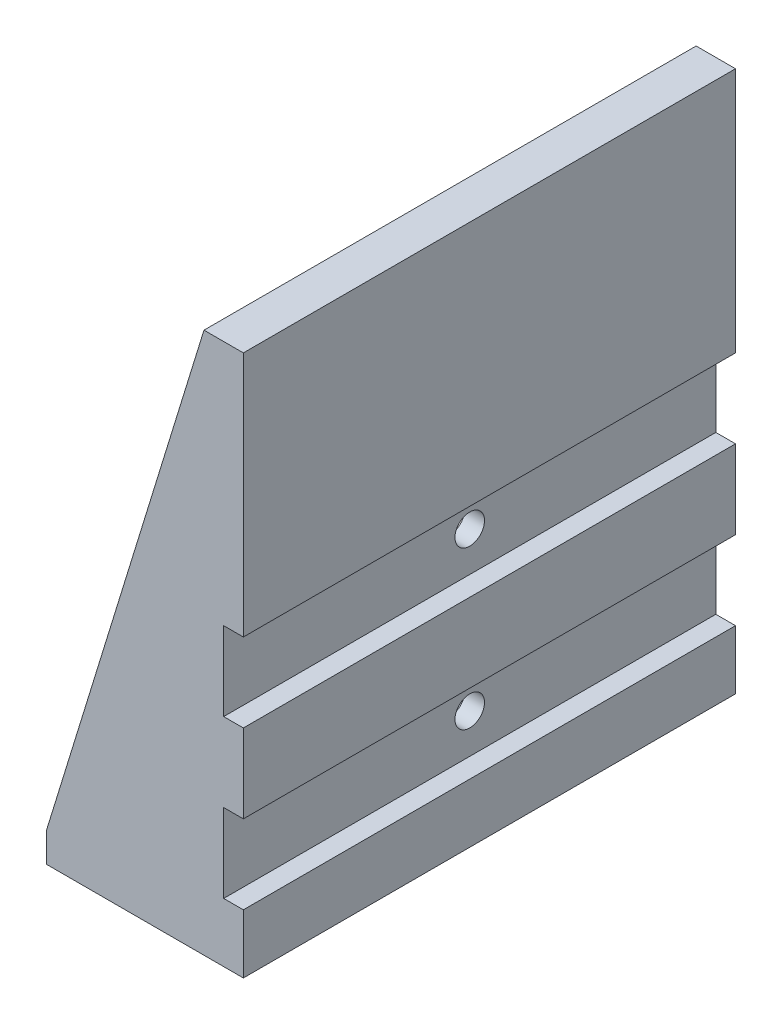
ISO-10303-21;
HEADER;
FILE_DESCRIPTION(('STEP AP214'),'2;1');
FILE_NAME('part.step','',(''),(''),'','','');
FILE_SCHEMA(('AUTOMOTIVE_DESIGN { 1 0 10303 214 1 1 1 1 }'));
ENDSEC;
DATA;
#1=APPLICATION_CONTEXT('core data for automotive mechanical design processes');
#2=APPLICATION_PROTOCOL_DEFINITION('international standard','automotive_design',2000,#1);
#3=PRODUCT_CONTEXT('',#1,'mechanical');
#4=PRODUCT('Part','Part','',(#3));
#5=PRODUCT_RELATED_PRODUCT_CATEGORY('part','',(#4));
#6=PRODUCT_DEFINITION_FORMATION('','',#4);
#7=PRODUCT_DEFINITION_CONTEXT('part definition',#1,'design');
#8=PRODUCT_DEFINITION('design','',#6,#7);
#9=PRODUCT_DEFINITION_SHAPE('','',#8);
#10=(LENGTH_UNIT() NAMED_UNIT(*) SI_UNIT(.MILLI.,.METRE.));
#11=(NAMED_UNIT(*) PLANE_ANGLE_UNIT() SI_UNIT($,.RADIAN.));
#12=(NAMED_UNIT(*) SI_UNIT($,.STERADIAN.) SOLID_ANGLE_UNIT());
#13=UNCERTAINTY_MEASURE_WITH_UNIT(LENGTH_MEASURE(1.E-05),#10,'distance_accuracy_value','');
#14=(GEOMETRIC_REPRESENTATION_CONTEXT(3) GLOBAL_UNCERTAINTY_ASSIGNED_CONTEXT((#13)) GLOBAL_UNIT_ASSIGNED_CONTEXT((#10,
#11,#12)) REPRESENTATION_CONTEXT('',''));
#15=CARTESIAN_POINT('',(0.,0.,0.));
#16=DIRECTION('',(0.,0.,1.));
#17=DIRECTION('',(1.,0.,0.));
#18=AXIS2_PLACEMENT_3D('',#15,#16,#17);
#19=CARTESIAN_POINT('',(-10.,3.,50.));
#20=DIRECTION('',(0.95577900872195,-0.294085848837523,0.));
#21=DIRECTION('',(0.294085848837523,0.95577900872195,0.));
#22=AXIS2_PLACEMENT_3D('',#19,#20,#21);
#23=PLANE('',#22);
#24=DIRECTION('',(0.,0.,-1.));
#25=VECTOR('',#24,1.);
#26=CARTESIAN_POINT('',(6.,55.,50.));
#27=LINE('',#26,#25);
#28=CARTESIAN_POINT('',(6.,55.,50.));
#29=VERTEX_POINT('',#28);
#30=CARTESIAN_POINT('',(6.,55.,47.5));
#31=VERTEX_POINT('',#30);
#32=EDGE_CURVE('E325',#29,#31,#27,.T.);
#33=ORIENTED_EDGE('',*,*,#32,.T.);
#34=DIRECTION('',(-0.294085848837523,-0.95577900872195,0.));
#35=VECTOR('',#34,1.);
#36=CARTESIAN_POINT('',(-10.,3.,47.5));
#37=LINE('',#36,#35);
#38=CARTESIAN_POINT('',(-10.,3.,47.5));
#39=VERTEX_POINT('',#38);
#40=EDGE_CURVE('E11',#31,#39,#37,.T.);
#41=ORIENTED_EDGE('',*,*,#40,.T.);
#42=DIRECTION('',(0.,0.,-1.));
#43=VECTOR('',#42,1.);
#44=CARTESIAN_POINT('',(-10.,3.,50.));
#45=LINE('',#44,#43);
#46=CARTESIAN_POINT('',(-10.,3.,50.));
#47=VERTEX_POINT('',#46);
#48=EDGE_CURVE('E321',#47,#39,#45,.T.);
#49=ORIENTED_EDGE('',*,*,#48,.F.);
#50=DIRECTION('',(-0.294085848837523,-0.95577900872195,0.));
#51=VECTOR('',#50,1.);
#52=CARTESIAN_POINT('',(-10.,3.,50.));
#53=LINE('',#52,#51);
#54=EDGE_CURVE('E294',#29,#47,#53,.T.);
#55=ORIENTED_EDGE('',*,*,#54,.F.);
#56=EDGE_LOOP('',(#33,#41,#49,#55));
#57=FACE_BOUND('',#56,.T.);
#58=ADVANCED_FACE('F33',(#57),#23,.F.);
#59=CARTESIAN_POINT('',(10.,0.,50.));
#60=DIRECTION('',(-1.,0.,0.));
#61=DIRECTION('',(0.,0.,1.));
#62=AXIS2_PLACEMENT_3D('',#59,#60,#61);
#63=PLANE('',#62);
#64=DIRECTION('',(0.,1.,0.));
#65=VECTOR('',#64,1.);
#66=CARTESIAN_POINT('',(10.,0.,50.));
#67=LINE('',#66,#65);
#68=CARTESIAN_POINT('',(10.,30.,50.));
#69=VERTEX_POINT('',#68);
#70=CARTESIAN_POINT('',(10.,55.,50.));
#71=VERTEX_POINT('',#70);
#72=EDGE_CURVE('E292',#69,#71,#67,.T.);
#73=ORIENTED_EDGE('',*,*,#72,.F.);
#74=DIRECTION('',(0.,0.,1.));
#75=VECTOR('',#74,1.);
#76=CARTESIAN_POINT('',(10.,30.,50.));
#77=LINE('',#76,#75);
#78=CARTESIAN_POINT('',(10.,30.,0.));
#79=VERTEX_POINT('',#78);
#80=EDGE_CURVE('E243',#79,#69,#77,.T.);
#81=ORIENTED_EDGE('',*,*,#80,.F.);
#82=DIRECTION('',(0.,1.,0.));
#83=VECTOR('',#82,1.);
#84=CARTESIAN_POINT('',(10.,0.,0.));
#85=LINE('',#84,#83);
#86=CARTESIAN_POINT('',(10.,55.,0.));
#87=VERTEX_POINT('',#86);
#88=EDGE_CURVE('E280',#79,#87,#85,.T.);
#89=ORIENTED_EDGE('',*,*,#88,.T.);
#90=DIRECTION('',(0.,0.,-1.));
#91=VECTOR('',#90,1.);
#92=CARTESIAN_POINT('',(10.,55.,50.));
#93=LINE('',#92,#91);
#94=EDGE_CURVE('E328',#71,#87,#93,.T.);
#95=ORIENTED_EDGE('',*,*,#94,.F.);
#96=EDGE_LOOP('',(#73,#81,#89,#95));
#97=FACE_BOUND('',#96,.T.);
#98=ADVANCED_FACE('F387',(#97),#63,.F.);
#99=CARTESIAN_POINT('',(10.,14.,0.));
#100=VERTEX_POINT('',#99);
#101=CARTESIAN_POINT('',(10.,22.,0.));
#102=VERTEX_POINT('',#101);
#103=EDGE_CURVE('E305',#100,#102,#85,.T.);
#104=ORIENTED_EDGE('',*,*,#103,.T.);
#105=DIRECTION('',(0.,0.,-1.));
#106=VECTOR('',#105,1.);
#107=CARTESIAN_POINT('',(10.,22.,50.));
#108=LINE('',#107,#106);
#109=CARTESIAN_POINT('',(10.,22.,50.));
#110=VERTEX_POINT('',#109);
#111=EDGE_CURVE('E237',#110,#102,#108,.T.);
#112=ORIENTED_EDGE('',*,*,#111,.F.);
#113=CARTESIAN_POINT('',(10.,14.,50.));
#114=VERTEX_POINT('',#113);
#115=EDGE_CURVE('E291',#114,#110,#67,.T.);
#116=ORIENTED_EDGE('',*,*,#115,.F.);
#117=DIRECTION('',(0.,0.,1.));
#118=VECTOR('',#117,1.);
#119=CARTESIAN_POINT('',(10.,14.,50.));
#120=LINE('',#119,#118);
#121=EDGE_CURVE('E267',#100,#114,#120,.T.);
#122=ORIENTED_EDGE('',*,*,#121,.F.);
#123=EDGE_LOOP('',(#104,#112,#116,#122));
#124=FACE_BOUND('',#123,.T.);
#125=ADVANCED_FACE('F392',(#124),#63,.F.);
#126=CARTESIAN_POINT('',(10.,0.,0.));
#127=VERTEX_POINT('',#126);
#128=CARTESIAN_POINT('',(10.,6.00000000000001,0.));
#129=VERTEX_POINT('',#128);
#130=EDGE_CURVE('E301',#127,#129,#85,.T.);
#131=ORIENTED_EDGE('',*,*,#130,.T.);
#132=DIRECTION('',(0.,0.,-1.));
#133=VECTOR('',#132,1.);
#134=CARTESIAN_POINT('',(10.,6.,50.));
#135=LINE('',#134,#133);
#136=CARTESIAN_POINT('',(10.,6.,50.));
#137=VERTEX_POINT('',#136);
#138=EDGE_CURVE('E256',#137,#129,#135,.T.);
#139=ORIENTED_EDGE('',*,*,#138,.F.);
#140=CARTESIAN_POINT('',(10.,0.,50.));
#141=VERTEX_POINT('',#140);
#142=EDGE_CURVE('E287',#141,#137,#67,.T.);
#143=ORIENTED_EDGE('',*,*,#142,.F.);
#144=DIRECTION('',(0.,0.,-1.));
#145=VECTOR('',#144,1.);
#146=CARTESIAN_POINT('',(10.,0.,50.));
#147=LINE('',#146,#145);
#148=EDGE_CURVE('E300',#141,#127,#147,.T.);
#149=ORIENTED_EDGE('',*,*,#148,.T.);
#150=EDGE_LOOP('',(#131,#139,#143,#149));
#151=FACE_BOUND('',#150,.T.);
#152=ADVANCED_FACE('F35',(#151),#63,.F.);
#153=CARTESIAN_POINT('',(6.,55.,50.));
#154=DIRECTION('',(0.,-1.,0.));
#155=DIRECTION('',(0.,0.,-1.));
#156=AXIS2_PLACEMENT_3D('',#153,#154,#155);
#157=PLANE('',#156);
#158=DIRECTION('',(-1.,0.,0.));
#159=VECTOR('',#158,1.);
#160=CARTESIAN_POINT('',(6.,55.,0.));
#161=LINE('',#160,#159);
#162=CARTESIAN_POINT('',(6.,55.,0.));
#163=VERTEX_POINT('',#162);
#164=EDGE_CURVE('E304',#87,#163,#161,.T.);
#165=ORIENTED_EDGE('',*,*,#164,.T.);
#166=CARTESIAN_POINT('',(6.,55.,2.5));
#167=VERTEX_POINT('',#166);
#168=EDGE_CURVE('E324',#167,#163,#27,.T.);
#169=ORIENTED_EDGE('',*,*,#168,.F.);
#170=DIRECTION('',(0.,0.,-1.));
#171=VECTOR('',#170,1.);
#172=CARTESIAN_POINT('',(6.,55.,2.5));
#173=LINE('',#172,#171);
#174=EDGE_CURVE('E220',#31,#167,#173,.T.);
#175=ORIENTED_EDGE('',*,*,#174,.F.);
#176=ORIENTED_EDGE('',*,*,#32,.F.);
#177=DIRECTION('',(-1.,0.,0.));
#178=VECTOR('',#177,1.);
#179=CARTESIAN_POINT('',(6.,55.,50.));
#180=LINE('',#179,#178);
#181=EDGE_CURVE('E290',#71,#29,#180,.T.);
#182=ORIENTED_EDGE('',*,*,#181,.F.);
#183=ORIENTED_EDGE('',*,*,#94,.T.);
#184=EDGE_LOOP('',(#165,#169,#175,#176,#182,#183));
#185=FACE_BOUND('',#184,.T.);
#186=ADVANCED_FACE('F340',(#185),#157,.F.);
#187=CARTESIAN_POINT('',(-10.,3.,2.5));
#188=VERTEX_POINT('',#187);
#189=CARTESIAN_POINT('',(-10.,3.,0.));
#190=VERTEX_POINT('',#189);
#191=EDGE_CURVE('E320',#188,#190,#45,.T.);
#192=ORIENTED_EDGE('',*,*,#191,.F.);
#193=DIRECTION('',(0.294085848837523,0.95577900872195,0.));
#194=VECTOR('',#193,1.);
#195=CARTESIAN_POINT('',(-10.,3.,2.5));
#196=LINE('',#195,#194);
#197=EDGE_CURVE('E41',#188,#167,#196,.T.);
#198=ORIENTED_EDGE('',*,*,#197,.T.);
#199=ORIENTED_EDGE('',*,*,#168,.T.);
#200=DIRECTION('',(-0.294085848837523,-0.95577900872195,0.));
#201=VECTOR('',#200,1.);
#202=CARTESIAN_POINT('',(-10.,3.,0.));
#203=LINE('',#202,#201);
#204=EDGE_CURVE('E308',#163,#190,#203,.T.);
#205=ORIENTED_EDGE('',*,*,#204,.T.);
#206=EDGE_LOOP('',(#192,#198,#199,#205));
#207=FACE_BOUND('',#206,.T.);
#208=ADVANCED_FACE('F335',(#207),#23,.F.);
#209=CARTESIAN_POINT('',(-10.,0.,50.));
#210=DIRECTION('',(1.,0.,0.));
#211=DIRECTION('',(0.,0.,-1.));
#212=AXIS2_PLACEMENT_3D('',#209,#210,#211);
#213=PLANE('',#212);
#214=DIRECTION('',(0.,-1.,0.));
#215=VECTOR('',#214,1.);
#216=CARTESIAN_POINT('',(-10.,0.,0.));
#217=LINE('',#216,#215);
#218=CARTESIAN_POINT('',(-10.,0.,0.));
#219=VERTEX_POINT('',#218);
#220=EDGE_CURVE('E311',#190,#219,#217,.T.);
#221=ORIENTED_EDGE('',*,*,#220,.T.);
#222=DIRECTION('',(0.,0.,-1.));
#223=VECTOR('',#222,1.);
#224=CARTESIAN_POINT('',(-10.,0.,50.));
#225=LINE('',#224,#223);
#226=CARTESIAN_POINT('',(-10.,0.,50.));
#227=VERTEX_POINT('',#226);
#228=EDGE_CURVE('E317',#227,#219,#225,.T.);
#229=ORIENTED_EDGE('',*,*,#228,.F.);
#230=DIRECTION('',(0.,-1.,0.));
#231=VECTOR('',#230,1.);
#232=CARTESIAN_POINT('',(-10.,0.,50.));
#233=LINE('',#232,#231);
#234=EDGE_CURVE('E296',#47,#227,#233,.T.);
#235=ORIENTED_EDGE('',*,*,#234,.F.);
#236=ORIENTED_EDGE('',*,*,#48,.T.);
#237=DIRECTION('',(0.,0.,1.));
#238=VECTOR('',#237,1.);
#239=CARTESIAN_POINT('',(-10.,3.,47.5));
#240=LINE('',#239,#238);
#241=EDGE_CURVE('E219',#188,#39,#240,.T.);
#242=ORIENTED_EDGE('',*,*,#241,.F.);
#243=ORIENTED_EDGE('',*,*,#191,.T.);
#244=EDGE_LOOP('',(#221,#229,#235,#236,#242,#243));
#245=FACE_BOUND('',#244,.T.);
#246=ADVANCED_FACE('F355',(#245),#213,.F.);
#247=CARTESIAN_POINT('',(-10.,0.,50.));
#248=DIRECTION('',(0.,1.,0.));
#249=DIRECTION('',(-1.,0.,0.));
#250=AXIS2_PLACEMENT_3D('',#247,#248,#249);
#251=PLANE('',#250);
#252=DIRECTION('',(-1.,0.,0.));
#253=VECTOR('',#252,1.);
#254=CARTESIAN_POINT('',(-10.,0.,24.));
#255=LINE('',#254,#253);
#256=CARTESIAN_POINT('',(3.,0.,24.));
#257=VERTEX_POINT('',#256);
#258=CARTESIAN_POINT('',(-7.,0.,24.));
#259=VERTEX_POINT('',#258);
#260=EDGE_CURVE('E201',#257,#259,#255,.T.);
#261=ORIENTED_EDGE('',*,*,#260,.T.);
#262=CARTESIAN_POINT('',(-7.,0.,25.));
#263=DIRECTION('',(0.,1.,0.));
#264=DIRECTION('',(-1.,0.,0.));
#265=AXIS2_PLACEMENT_3D('',#262,#263,#264);
#266=CIRCLE('',#265,1.);
#267=CARTESIAN_POINT('',(-7.,0.,26.));
#268=VERTEX_POINT('',#267);
#269=EDGE_CURVE('E204',#259,#268,#266,.T.);
#270=ORIENTED_EDGE('',*,*,#269,.T.);
#271=DIRECTION('',(1.,0.,0.));
#272=VECTOR('',#271,1.);
#273=CARTESIAN_POINT('',(-10.,0.,26.));
#274=LINE('',#273,#272);
#275=CARTESIAN_POINT('',(3.,0.,26.));
#276=VERTEX_POINT('',#275);
#277=EDGE_CURVE('E196',#268,#276,#274,.T.);
#278=ORIENTED_EDGE('',*,*,#277,.T.);
#279=CARTESIAN_POINT('',(3.,0.,25.));
#280=DIRECTION('',(0.,1.,0.));
#281=DIRECTION('',(-1.,0.,0.));
#282=AXIS2_PLACEMENT_3D('',#279,#280,#281);
#283=CIRCLE('',#282,1.);
#284=EDGE_CURVE('E176',#276,#257,#283,.T.);
#285=ORIENTED_EDGE('',*,*,#284,.T.);
#286=EDGE_LOOP('',(#261,#270,#278,#285));
#287=FACE_BOUND('',#286,.T.);
#288=DIRECTION('',(1.,0.,0.));
#289=VECTOR('',#288,1.);
#290=CARTESIAN_POINT('',(-10.,0.,0.));
#291=LINE('',#290,#289);
#292=EDGE_CURVE('E313',#219,#127,#291,.T.);
#293=ORIENTED_EDGE('',*,*,#292,.T.);
#294=ORIENTED_EDGE('',*,*,#148,.F.);
#295=DIRECTION('',(1.,0.,0.));
#296=VECTOR('',#295,1.);
#297=CARTESIAN_POINT('',(-10.,0.,50.));
#298=LINE('',#297,#296);
#299=EDGE_CURVE('E298',#227,#141,#298,.T.);
#300=ORIENTED_EDGE('',*,*,#299,.F.);
#301=ORIENTED_EDGE('',*,*,#228,.T.);
#302=EDGE_LOOP('',(#293,#294,#300,#301));
#303=FACE_BOUND('',#302,.T.);
#304=ADVANCED_FACE('F359',(#287,#303),#251,.F.);
#305=CARTESIAN_POINT('',(0.,0.,50.));
#306=DIRECTION('',(0.,0.,-1.));
#307=DIRECTION('',(-1.,0.,0.));
#308=AXIS2_PLACEMENT_3D('',#305,#306,#307);
#309=PLANE('',#308);
#310=DIRECTION('',(0.,-1.,0.));
#311=VECTOR('',#310,1.);
#312=CARTESIAN_POINT('',(8.,22.,50.));
#313=LINE('',#312,#311);
#314=CARTESIAN_POINT('',(8.,30.,50.));
#315=VERTEX_POINT('',#314);
#316=CARTESIAN_POINT('',(8.,22.,50.));
#317=VERTEX_POINT('',#316);
#318=EDGE_CURVE('E239',#315,#317,#313,.T.);
#319=ORIENTED_EDGE('',*,*,#318,.F.);
#320=DIRECTION('',(1.,0.,0.));
#321=VECTOR('',#320,1.);
#322=CARTESIAN_POINT('',(8.,30.,50.));
#323=LINE('',#322,#321);
#324=EDGE_CURVE('E253',#315,#69,#323,.T.);
#325=ORIENTED_EDGE('',*,*,#324,.T.);
#326=ORIENTED_EDGE('',*,*,#72,.T.);
#327=ORIENTED_EDGE('',*,*,#181,.T.);
#328=ORIENTED_EDGE('',*,*,#54,.T.);
#329=ORIENTED_EDGE('',*,*,#234,.T.);
#330=ORIENTED_EDGE('',*,*,#299,.T.);
#331=ORIENTED_EDGE('',*,*,#142,.T.);
#332=DIRECTION('',(1.,0.,0.));
#333=VECTOR('',#332,1.);
#334=CARTESIAN_POINT('',(8.,6.,50.));
#335=LINE('',#334,#333);
#336=CARTESIAN_POINT('',(8.,6.,50.));
#337=VERTEX_POINT('',#336);
#338=EDGE_CURVE('E274',#337,#137,#335,.T.);
#339=ORIENTED_EDGE('',*,*,#338,.F.);
#340=DIRECTION('',(0.,-1.,0.));
#341=VECTOR('',#340,1.);
#342=CARTESIAN_POINT('',(8.,14.,50.));
#343=LINE('',#342,#341);
#344=CARTESIAN_POINT('',(8.,14.,50.));
#345=VERTEX_POINT('',#344);
#346=EDGE_CURVE('E263',#345,#337,#343,.T.);
#347=ORIENTED_EDGE('',*,*,#346,.F.);
#348=DIRECTION('',(1.,0.,0.));
#349=VECTOR('',#348,1.);
#350=CARTESIAN_POINT('',(8.,14.,50.));
#351=LINE('',#350,#349);
#352=EDGE_CURVE('E277',#345,#114,#351,.T.);
#353=ORIENTED_EDGE('',*,*,#352,.T.);
#354=ORIENTED_EDGE('',*,*,#115,.T.);
#355=DIRECTION('',(1.,0.,0.));
#356=VECTOR('',#355,1.);
#357=CARTESIAN_POINT('',(8.,22.,50.));
#358=LINE('',#357,#356);
#359=EDGE_CURVE('E250',#317,#110,#358,.T.);
#360=ORIENTED_EDGE('',*,*,#359,.F.);
#361=EDGE_LOOP('',(#319,#325,#326,#327,#328,#329,#330,#331,#339,#347,#353,#354,#360));
#362=FACE_BOUND('',#361,.T.);
#363=ADVANCED_FACE('F364',(#362),#309,.F.);
#364=CARTESIAN_POINT('',(0.,0.,0.));
#365=DIRECTION('',(0.,0.,-1.));
#366=DIRECTION('',(-1.,0.,0.));
#367=AXIS2_PLACEMENT_3D('',#364,#365,#366);
#368=PLANE('',#367);
#369=DIRECTION('',(1.,0.,0.));
#370=VECTOR('',#369,1.);
#371=CARTESIAN_POINT('',(8.,30.,0.));
#372=LINE('',#371,#370);
#373=CARTESIAN_POINT('',(8.,30.,0.));
#374=VERTEX_POINT('',#373);
#375=EDGE_CURVE('E257',#374,#79,#372,.T.);
#376=ORIENTED_EDGE('',*,*,#375,.F.);
#377=DIRECTION('',(0.,1.,0.));
#378=VECTOR('',#377,1.);
#379=CARTESIAN_POINT('',(8.,22.,0.));
#380=LINE('',#379,#378);
#381=CARTESIAN_POINT('',(8.,22.,0.));
#382=VERTEX_POINT('',#381);
#383=EDGE_CURVE('E245',#382,#374,#380,.T.);
#384=ORIENTED_EDGE('',*,*,#383,.F.);
#385=DIRECTION('',(1.,0.,0.));
#386=VECTOR('',#385,1.);
#387=CARTESIAN_POINT('',(8.,22.,0.));
#388=LINE('',#387,#386);
#389=EDGE_CURVE('E259',#382,#102,#388,.T.);
#390=ORIENTED_EDGE('',*,*,#389,.T.);
#391=ORIENTED_EDGE('',*,*,#103,.F.);
#392=DIRECTION('',(1.,0.,0.));
#393=VECTOR('',#392,1.);
#394=CARTESIAN_POINT('',(8.,14.,0.));
#395=LINE('',#394,#393);
#396=CARTESIAN_POINT('',(8.,14.,0.));
#397=VERTEX_POINT('',#396);
#398=EDGE_CURVE('E281',#397,#100,#395,.T.);
#399=ORIENTED_EDGE('',*,*,#398,.F.);
#400=DIRECTION('',(0.,1.,0.));
#401=VECTOR('',#400,1.);
#402=CARTESIAN_POINT('',(8.,14.,0.));
#403=LINE('',#402,#401);
#404=CARTESIAN_POINT('',(8.,6.,0.));
#405=VERTEX_POINT('',#404);
#406=EDGE_CURVE('E269',#405,#397,#403,.T.);
#407=ORIENTED_EDGE('',*,*,#406,.F.);
#408=DIRECTION('',(1.,0.,0.));
#409=VECTOR('',#408,1.);
#410=CARTESIAN_POINT('',(8.,6.00000000000001,0.));
#411=LINE('',#410,#409);
#412=EDGE_CURVE('E283',#405,#129,#411,.T.);
#413=ORIENTED_EDGE('',*,*,#412,.T.);
#414=ORIENTED_EDGE('',*,*,#130,.F.);
#415=ORIENTED_EDGE('',*,*,#292,.F.);
#416=ORIENTED_EDGE('',*,*,#220,.F.);
#417=ORIENTED_EDGE('',*,*,#204,.F.);
#418=ORIENTED_EDGE('',*,*,#164,.F.);
#419=ORIENTED_EDGE('',*,*,#88,.F.);
#420=EDGE_LOOP('',(#376,#384,#390,#391,#399,#407,#413,#414,#415,#416,#417,#418,#419));
#421=FACE_BOUND('',#420,.T.);
#422=ADVANCED_FACE('F350',(#421),#368,.T.);
#423=CARTESIAN_POINT('',(8.,14.,50.));
#424=DIRECTION('',(0.,1.,0.));
#425=DIRECTION('',(0.,0.,1.));
#426=AXIS2_PLACEMENT_3D('',#423,#424,#425);
#427=PLANE('',#426);
#428=ORIENTED_EDGE('',*,*,#121,.T.);
#429=ORIENTED_EDGE('',*,*,#352,.F.);
#430=DIRECTION('',(0.,0.,1.));
#431=VECTOR('',#430,1.);
#432=CARTESIAN_POINT('',(8.,14.,50.));
#433=LINE('',#432,#431);
#434=EDGE_CURVE('E271',#397,#345,#433,.T.);
#435=ORIENTED_EDGE('',*,*,#434,.F.);
#436=ORIENTED_EDGE('',*,*,#398,.T.);
#437=EDGE_LOOP('',(#428,#429,#435,#436));
#438=FACE_BOUND('',#437,.T.);
#439=ADVANCED_FACE('F421',(#438),#427,.F.);
#440=CARTESIAN_POINT('',(8.,6.,50.));
#441=DIRECTION('',(0.,-1.,0.));
#442=DIRECTION('',(0.,0.,-1.));
#443=AXIS2_PLACEMENT_3D('',#440,#441,#442);
#444=PLANE('',#443);
#445=ORIENTED_EDGE('',*,*,#138,.T.);
#446=ORIENTED_EDGE('',*,*,#412,.F.);
#447=DIRECTION('',(0.,0.,-1.));
#448=VECTOR('',#447,1.);
#449=CARTESIAN_POINT('',(8.,6.,50.));
#450=LINE('',#449,#448);
#451=EDGE_CURVE('E266',#337,#405,#450,.T.);
#452=ORIENTED_EDGE('',*,*,#451,.F.);
#453=ORIENTED_EDGE('',*,*,#338,.T.);
#454=EDGE_LOOP('',(#445,#446,#452,#453));
#455=FACE_BOUND('',#454,.T.);
#456=ADVANCED_FACE('F413',(#455),#444,.F.);
#457=CARTESIAN_POINT('',(8.,0.,0.));
#458=DIRECTION('',(1.,0.,0.));
#459=DIRECTION('',(0.,0.,-1.));
#460=AXIS2_PLACEMENT_3D('',#457,#458,#459);
#461=PLANE('',#460);
#462=CARTESIAN_POINT('',(8.,10.,25.));
#463=DIRECTION('',(1.,0.,0.));
#464=DIRECTION('',(0.,0.,-1.));
#465=AXIS2_PLACEMENT_3D('',#462,#463,#464);
#466=CIRCLE('',#465,1.5);
#467=CARTESIAN_POINT('',(8.,10.,23.5));
#468=VERTEX_POINT('',#467);
#469=EDGE_CURVE('E207',#468,#468,#466,.T.);
#470=ORIENTED_EDGE('',*,*,#469,.F.);
#471=EDGE_LOOP('',(#470));
#472=FACE_BOUND('',#471,.T.);
#473=ORIENTED_EDGE('',*,*,#346,.T.);
#474=ORIENTED_EDGE('',*,*,#451,.T.);
#475=ORIENTED_EDGE('',*,*,#406,.T.);
#476=ORIENTED_EDGE('',*,*,#434,.T.);
#477=EDGE_LOOP('',(#473,#474,#475,#476));
#478=FACE_BOUND('',#477,.T.);
#479=ADVANCED_FACE('F418',(#472,#478),#461,.T.);
#480=CARTESIAN_POINT('',(8.,30.,50.));
#481=DIRECTION('',(0.,1.,0.));
#482=DIRECTION('',(0.,0.,1.));
#483=AXIS2_PLACEMENT_3D('',#480,#481,#482);
#484=PLANE('',#483);
#485=ORIENTED_EDGE('',*,*,#80,.T.);
#486=ORIENTED_EDGE('',*,*,#324,.F.);
#487=DIRECTION('',(0.,0.,1.));
#488=VECTOR('',#487,1.);
#489=CARTESIAN_POINT('',(8.,30.,50.));
#490=LINE('',#489,#488);
#491=EDGE_CURVE('E247',#374,#315,#490,.T.);
#492=ORIENTED_EDGE('',*,*,#491,.F.);
#493=ORIENTED_EDGE('',*,*,#375,.T.);
#494=EDGE_LOOP('',(#485,#486,#492,#493));
#495=FACE_BOUND('',#494,.T.);
#496=ADVANCED_FACE('F432',(#495),#484,.F.);
#497=CARTESIAN_POINT('',(8.,22.,50.));
#498=DIRECTION('',(0.,-1.,0.));
#499=DIRECTION('',(0.,0.,-1.));
#500=AXIS2_PLACEMENT_3D('',#497,#498,#499);
#501=PLANE('',#500);
#502=ORIENTED_EDGE('',*,*,#111,.T.);
#503=ORIENTED_EDGE('',*,*,#389,.F.);
#504=DIRECTION('',(0.,0.,-1.));
#505=VECTOR('',#504,1.);
#506=CARTESIAN_POINT('',(8.,22.,50.));
#507=LINE('',#506,#505);
#508=EDGE_CURVE('E242',#317,#382,#507,.T.);
#509=ORIENTED_EDGE('',*,*,#508,.F.);
#510=ORIENTED_EDGE('',*,*,#359,.T.);
#511=EDGE_LOOP('',(#502,#503,#509,#510));
#512=FACE_BOUND('',#511,.T.);
#513=ADVANCED_FACE('F436',(#512),#501,.F.);
#514=CARTESIAN_POINT('',(8.,0.,0.));
#515=DIRECTION('',(-1.,0.,0.));
#516=DIRECTION('',(0.,0.,1.));
#517=AXIS2_PLACEMENT_3D('',#514,#515,#516);
#518=PLANE('',#517);
#519=CARTESIAN_POINT('',(8.,26.,25.));
#520=DIRECTION('',(1.,0.,0.));
#521=DIRECTION('',(0.,0.,-1.));
#522=AXIS2_PLACEMENT_3D('',#519,#520,#521);
#523=CIRCLE('',#522,1.5);
#524=CARTESIAN_POINT('',(8.,26.,23.5));
#525=VERTEX_POINT('',#524);
#526=EDGE_CURVE('E213',#525,#525,#523,.T.);
#527=ORIENTED_EDGE('',*,*,#526,.F.);
#528=EDGE_LOOP('',(#527));
#529=FACE_BOUND('',#528,.T.);
#530=ORIENTED_EDGE('',*,*,#318,.T.);
#531=ORIENTED_EDGE('',*,*,#508,.T.);
#532=ORIENTED_EDGE('',*,*,#383,.T.);
#533=ORIENTED_EDGE('',*,*,#491,.T.);
#534=EDGE_LOOP('',(#530,#531,#532,#533));
#535=FACE_BOUND('',#534,.T.);
#536=ADVANCED_FACE('F383',(#529,#535),#518,.F.);
#537=CARTESIAN_POINT('',(6.,55.,47.5));
#538=DIRECTION('',(0.,0.,1.));
#539=DIRECTION('',(0.,-1.,0.));
#540=AXIS2_PLACEMENT_3D('',#537,#538,#539);
#541=PLANE('',#540);
#542=DIRECTION('',(0.,1.,0.));
#543=VECTOR('',#542,1.);
#544=CARTESIAN_POINT('',(6.,55.,47.5));
#545=LINE('',#544,#543);
#546=CARTESIAN_POINT('',(6.,3.,47.5));
#547=VERTEX_POINT('',#546);
#548=EDGE_CURVE('E229',#547,#31,#545,.T.);
#549=ORIENTED_EDGE('',*,*,#548,.F.);
#550=DIRECTION('',(-1.,0.,0.));
#551=VECTOR('',#550,1.);
#552=CARTESIAN_POINT('',(6.,3.,47.5));
#553=LINE('',#552,#551);
#554=EDGE_CURVE('E235',#547,#39,#553,.T.);
#555=ORIENTED_EDGE('',*,*,#554,.T.);
#556=ORIENTED_EDGE('',*,*,#40,.F.);
#557=EDGE_LOOP('',(#549,#555,#556));
#558=FACE_BOUND('',#557,.T.);
#559=ADVANCED_FACE('F371',(#558),#541,.F.);
#560=CARTESIAN_POINT('',(6.,55.,2.5));
#561=DIRECTION('',(0.,0.,-1.));
#562=DIRECTION('',(0.,1.,0.));
#563=AXIS2_PLACEMENT_3D('',#560,#561,#562);
#564=PLANE('',#563);
#565=DIRECTION('',(-1.,0.,0.));
#566=VECTOR('',#565,1.);
#567=CARTESIAN_POINT('',(6.,3.,2.5));
#568=LINE('',#567,#566);
#569=CARTESIAN_POINT('',(6.,3.,2.5));
#570=VERTEX_POINT('',#569);
#571=EDGE_CURVE('E232',#570,#188,#568,.T.);
#572=ORIENTED_EDGE('',*,*,#571,.F.);
#573=DIRECTION('',(0.,-1.,0.));
#574=VECTOR('',#573,1.);
#575=CARTESIAN_POINT('',(6.,55.,2.5));
#576=LINE('',#575,#574);
#577=EDGE_CURVE('E223',#167,#570,#576,.T.);
#578=ORIENTED_EDGE('',*,*,#577,.F.);
#579=ORIENTED_EDGE('',*,*,#197,.F.);
#580=EDGE_LOOP('',(#572,#578,#579));
#581=FACE_BOUND('',#580,.T.);
#582=ADVANCED_FACE('F375',(#581),#564,.F.);
#583=CARTESIAN_POINT('',(6.,3.,47.5));
#584=DIRECTION('',(0.,-1.,0.));
#585=DIRECTION('',(0.,0.,-1.));
#586=AXIS2_PLACEMENT_3D('',#583,#584,#585);
#587=PLANE('',#586);
#588=DIRECTION('',(1.,0.,0.));
#589=VECTOR('',#588,1.);
#590=CARTESIAN_POINT('',(-7.,3.,26.));
#591=LINE('',#590,#589);
#592=CARTESIAN_POINT('',(-7.,3.,26.));
#593=VERTEX_POINT('',#592);
#594=CARTESIAN_POINT('',(3.,3.,26.));
#595=VERTEX_POINT('',#594);
#596=EDGE_CURVE('E182',#593,#595,#591,.T.);
#597=ORIENTED_EDGE('',*,*,#596,.F.);
#598=CARTESIAN_POINT('',(-7.,3.,25.));
#599=DIRECTION('',(0.,1.,0.));
#600=DIRECTION('',(0.,0.,1.));
#601=AXIS2_PLACEMENT_3D('',#598,#599,#600);
#602=CIRCLE('',#601,1.);
#603=CARTESIAN_POINT('',(-7.,3.,24.));
#604=VERTEX_POINT('',#603);
#605=EDGE_CURVE('E56',#604,#593,#602,.T.);
#606=ORIENTED_EDGE('',*,*,#605,.F.);
#607=DIRECTION('',(-1.,0.,0.));
#608=VECTOR('',#607,1.);
#609=CARTESIAN_POINT('',(-7.,3.,24.));
#610=LINE('',#609,#608);
#611=CARTESIAN_POINT('',(3.,3.,24.));
#612=VERTEX_POINT('',#611);
#613=EDGE_CURVE('E189',#612,#604,#610,.T.);
#614=ORIENTED_EDGE('',*,*,#613,.F.);
#615=CARTESIAN_POINT('',(3.,3.,25.));
#616=DIRECTION('',(0.,1.,0.));
#617=DIRECTION('',(0.,0.,1.));
#618=AXIS2_PLACEMENT_3D('',#615,#616,#617);
#619=CIRCLE('',#618,1.);
#620=EDGE_CURVE('E173',#595,#612,#619,.T.);
#621=ORIENTED_EDGE('',*,*,#620,.F.);
#622=EDGE_LOOP('',(#597,#606,#614,#621));
#623=FACE_BOUND('',#622,.T.);
#624=ORIENTED_EDGE('',*,*,#241,.T.);
#625=ORIENTED_EDGE('',*,*,#554,.F.);
#626=DIRECTION('',(0.,0.,1.));
#627=VECTOR('',#626,1.);
#628=CARTESIAN_POINT('',(6.,3.,47.5));
#629=LINE('',#628,#627);
#630=EDGE_CURVE('E226',#570,#547,#629,.T.);
#631=ORIENTED_EDGE('',*,*,#630,.F.);
#632=ORIENTED_EDGE('',*,*,#571,.T.);
#633=EDGE_LOOP('',(#624,#625,#631,#632));
#634=FACE_BOUND('',#633,.T.);
#635=ADVANCED_FACE('F186',(#623,#634),#587,.F.);
#636=CARTESIAN_POINT('',(6.,0.,0.));
#637=DIRECTION('',(1.,0.,0.));
#638=DIRECTION('',(0.,0.,-1.));
#639=AXIS2_PLACEMENT_3D('',#636,#637,#638);
#640=PLANE('',#639);
#641=CARTESIAN_POINT('',(6.,10.,25.));
#642=DIRECTION('',(1.,0.,0.));
#643=DIRECTION('',(0.,0.,-1.));
#644=AXIS2_PLACEMENT_3D('',#641,#642,#643);
#645=CIRCLE('',#644,1.5);
#646=CARTESIAN_POINT('',(6.,10.,23.5));
#647=VERTEX_POINT('',#646);
#648=EDGE_CURVE('E210',#647,#647,#645,.F.);
#649=ORIENTED_EDGE('',*,*,#648,.F.);
#650=EDGE_LOOP('',(#649));
#651=FACE_BOUND('',#650,.T.);
#652=CARTESIAN_POINT('',(6.,26.,25.));
#653=DIRECTION('',(1.,0.,0.));
#654=DIRECTION('',(0.,0.,-1.));
#655=AXIS2_PLACEMENT_3D('',#652,#653,#654);
#656=CIRCLE('',#655,1.5);
#657=CARTESIAN_POINT('',(6.,26.,23.5));
#658=VERTEX_POINT('',#657);
#659=EDGE_CURVE('E216',#658,#658,#656,.F.);
#660=ORIENTED_EDGE('',*,*,#659,.F.);
#661=EDGE_LOOP('',(#660));
#662=FACE_BOUND('',#661,.T.);
#663=ORIENTED_EDGE('',*,*,#174,.T.);
#664=ORIENTED_EDGE('',*,*,#577,.T.);
#665=ORIENTED_EDGE('',*,*,#630,.T.);
#666=ORIENTED_EDGE('',*,*,#548,.T.);
#667=EDGE_LOOP('',(#663,#664,#665,#666));
#668=FACE_BOUND('',#667,.T.);
#669=ADVANCED_FACE('F373',(#651,#662,#668),#640,.F.);
#670=CARTESIAN_POINT('',(1.75735931288072,26.,25.));
#671=DIRECTION('',(1.,0.,0.));
#672=DIRECTION('',(0.,0.,-1.));
#673=AXIS2_PLACEMENT_3D('',#670,#671,#672);
#674=CYLINDRICAL_SURFACE('',#673,1.5);
#675=ORIENTED_EDGE('',*,*,#659,.T.);
#676=EDGE_LOOP('',(#675));
#677=FACE_BOUND('',#676,.T.);
#678=ORIENTED_EDGE('',*,*,#526,.T.);
#679=EDGE_LOOP('',(#678));
#680=FACE_BOUND('',#679,.T.);
#681=ADVANCED_FACE('F473',(#677,#680),#674,.F.);
#682=CARTESIAN_POINT('',(1.75735931288072,10.,25.));
#683=DIRECTION('',(1.,0.,0.));
#684=DIRECTION('',(0.,0.,-1.));
#685=AXIS2_PLACEMENT_3D('',#682,#683,#684);
#686=CYLINDRICAL_SURFACE('',#685,1.5);
#687=ORIENTED_EDGE('',*,*,#648,.T.);
#688=EDGE_LOOP('',(#687));
#689=FACE_BOUND('',#688,.T.);
#690=ORIENTED_EDGE('',*,*,#469,.T.);
#691=EDGE_LOOP('',(#690));
#692=FACE_BOUND('',#691,.T.);
#693=ADVANCED_FACE('F466',(#689,#692),#686,.F.);
#694=CARTESIAN_POINT('',(-7.,-13.,25.));
#695=DIRECTION('',(0.,1.,0.));
#696=DIRECTION('',(0.,0.,1.));
#697=AXIS2_PLACEMENT_3D('',#694,#695,#696);
#698=CYLINDRICAL_SURFACE('',#697,1.);
#699=DIRECTION('',(0.,1.,0.));
#700=VECTOR('',#699,1.);
#701=CARTESIAN_POINT('',(-7.,-13.,24.));
#702=LINE('',#701,#700);
#703=EDGE_CURVE('E194',#259,#604,#702,.T.);
#704=ORIENTED_EDGE('',*,*,#703,.T.);
#705=ORIENTED_EDGE('',*,*,#605,.T.);
#706=DIRECTION('',(0.,1.,0.));
#707=VECTOR('',#706,1.);
#708=CARTESIAN_POINT('',(-7.,-13.,26.));
#709=LINE('',#708,#707);
#710=EDGE_CURVE('E179',#268,#593,#709,.T.);
#711=ORIENTED_EDGE('',*,*,#710,.F.);
#712=ORIENTED_EDGE('',*,*,#269,.F.);
#713=EDGE_LOOP('',(#704,#705,#711,#712));
#714=FACE_BOUND('',#713,.T.);
#715=ADVANCED_FACE('F464',(#714),#698,.F.);
#716=CARTESIAN_POINT('',(-7.,-13.,24.));
#717=DIRECTION('',(0.,0.,-1.));
#718=DIRECTION('',(0.,1.,0.));
#719=AXIS2_PLACEMENT_3D('',#716,#717,#718);
#720=PLANE('',#719);
#721=DIRECTION('',(0.,1.,0.));
#722=VECTOR('',#721,1.);
#723=CARTESIAN_POINT('',(3.,-13.,24.));
#724=LINE('',#723,#722);
#725=EDGE_CURVE('E178',#257,#612,#724,.T.);
#726=ORIENTED_EDGE('',*,*,#725,.T.);
#727=ORIENTED_EDGE('',*,*,#613,.T.);
#728=ORIENTED_EDGE('',*,*,#703,.F.);
#729=ORIENTED_EDGE('',*,*,#260,.F.);
#730=EDGE_LOOP('',(#726,#727,#728,#729));
#731=FACE_BOUND('',#730,.T.);
#732=ADVANCED_FACE('F463',(#731),#720,.F.);
#733=CARTESIAN_POINT('',(3.,-13.,25.));
#734=DIRECTION('',(0.,1.,0.));
#735=DIRECTION('',(0.,0.,1.));
#736=AXIS2_PLACEMENT_3D('',#733,#734,#735);
#737=CYLINDRICAL_SURFACE('',#736,1.);
#738=DIRECTION('',(0.,1.,0.));
#739=VECTOR('',#738,1.);
#740=CARTESIAN_POINT('',(3.,-13.,26.));
#741=LINE('',#740,#739);
#742=EDGE_CURVE('E48',#276,#595,#741,.T.);
#743=ORIENTED_EDGE('',*,*,#742,.T.);
#744=ORIENTED_EDGE('',*,*,#620,.T.);
#745=ORIENTED_EDGE('',*,*,#725,.F.);
#746=ORIENTED_EDGE('',*,*,#284,.F.);
#747=EDGE_LOOP('',(#743,#744,#745,#746));
#748=FACE_BOUND('',#747,.T.);
#749=ADVANCED_FACE('F170',(#748),#737,.F.);
#750=CARTESIAN_POINT('',(-7.,-13.,26.));
#751=DIRECTION('',(0.,0.,1.));
#752=DIRECTION('',(0.,-1.,0.));
#753=AXIS2_PLACEMENT_3D('',#750,#751,#752);
#754=PLANE('',#753);
#755=ORIENTED_EDGE('',*,*,#710,.T.);
#756=ORIENTED_EDGE('',*,*,#596,.T.);
#757=ORIENTED_EDGE('',*,*,#742,.F.);
#758=ORIENTED_EDGE('',*,*,#277,.F.);
#759=EDGE_LOOP('',(#755,#756,#757,#758));
#760=FACE_BOUND('',#759,.T.);
#761=ADVANCED_FACE('F183',(#760),#754,.F.);
#762=CLOSED_SHELL('',(#58,#98,#125,#152,#186,#208,#246,#304,#363,#422,#439,#456,#479,#496,#513,
#536,#559,#582,#635,#669,#681,#693,#715,#732,#749,#761));
#763=MANIFOLD_SOLID_BREP('B2',#762);
#764=ADVANCED_BREP_SHAPE_REPRESENTATION('',(#18,#763),#14);
#765=SHAPE_DEFINITION_REPRESENTATION(#9,#764);
ENDSEC;
END-ISO-10303-21;
